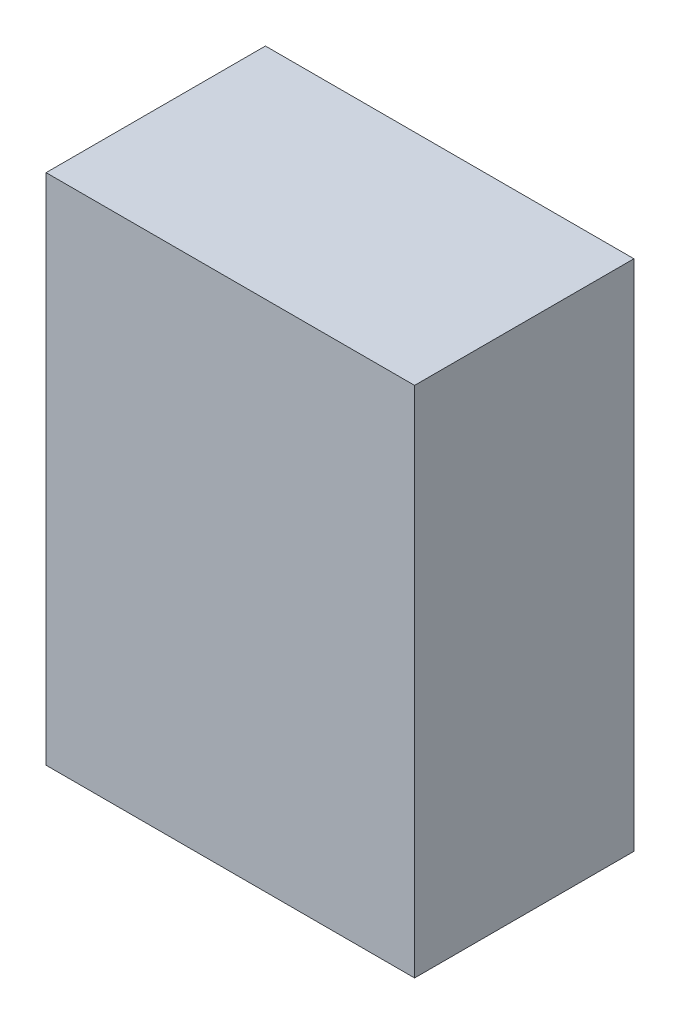
ISO-10303-21;
HEADER;
FILE_DESCRIPTION(('STEP AP214'),'2;1');
FILE_NAME('part.step','',(''),(''),'','','');
FILE_SCHEMA(('AUTOMOTIVE_DESIGN { 1 0 10303 214 1 1 1 1 }'));
ENDSEC;
DATA;
#1=APPLICATION_CONTEXT('core data for automotive mechanical design processes');
#2=APPLICATION_PROTOCOL_DEFINITION('international standard','automotive_design',2000,#1);
#3=PRODUCT_CONTEXT('',#1,'mechanical');
#4=PRODUCT('Part','Part','',(#3));
#5=PRODUCT_RELATED_PRODUCT_CATEGORY('part','',(#4));
#6=PRODUCT_DEFINITION_FORMATION('','',#4);
#7=PRODUCT_DEFINITION_CONTEXT('part definition',#1,'design');
#8=PRODUCT_DEFINITION('design','',#6,#7);
#9=PRODUCT_DEFINITION_SHAPE('','',#8);
#10=(LENGTH_UNIT() NAMED_UNIT(*) SI_UNIT(.MILLI.,.METRE.));
#11=(NAMED_UNIT(*) PLANE_ANGLE_UNIT() SI_UNIT($,.RADIAN.));
#12=(NAMED_UNIT(*) SI_UNIT($,.STERADIAN.) SOLID_ANGLE_UNIT());
#13=UNCERTAINTY_MEASURE_WITH_UNIT(LENGTH_MEASURE(1.E-05),#10,'distance_accuracy_value','');
#14=(GEOMETRIC_REPRESENTATION_CONTEXT(3) GLOBAL_UNCERTAINTY_ASSIGNED_CONTEXT((#13)) GLOBAL_UNIT_ASSIGNED_CONTEXT((#10,
#11,#12)) REPRESENTATION_CONTEXT('',''));
#15=CARTESIAN_POINT('',(0.,0.,0.));
#16=DIRECTION('',(0.,0.,1.));
#17=DIRECTION('',(1.,0.,0.));
#18=AXIS2_PLACEMENT_3D('',#15,#16,#17);
#19=CARTESIAN_POINT('',(-1.003,-1.397,0.));
#20=DIRECTION('',(0.,-1.,0.));
#21=DIRECTION('',(0.,0.,1.));
#22=AXIS2_PLACEMENT_3D('',#19,#20,#21);
#23=PLANE('',#22);
#24=DIRECTION('',(-1.,0.,0.));
#25=VECTOR('',#24,1.);
#26=CARTESIAN_POINT('',(1.003,-1.397,0.));
#27=LINE('',#26,#25);
#28=CARTESIAN_POINT('',(1.003,-1.397,0.));
#29=VERTEX_POINT('',#28);
#30=CARTESIAN_POINT('',(-1.003,-1.397,0.));
#31=VERTEX_POINT('',#30);
#32=EDGE_CURVE('E11',#29,#31,#27,.T.);
#33=ORIENTED_EDGE('',*,*,#32,.F.);
#34=DIRECTION('',(0.,0.,-1.));
#35=VECTOR('',#34,1.);
#36=CARTESIAN_POINT('',(1.003,-1.397,1.194));
#37=LINE('',#36,#35);
#38=CARTESIAN_POINT('',(1.003,-1.397,1.194));
#39=VERTEX_POINT('',#38);
#40=EDGE_CURVE('E24',#39,#29,#37,.T.);
#41=ORIENTED_EDGE('',*,*,#40,.F.);
#42=DIRECTION('',(1.,0.,0.));
#43=VECTOR('',#42,1.);
#44=CARTESIAN_POINT('',(-1.003,-1.397,1.194));
#45=LINE('',#44,#43);
#46=CARTESIAN_POINT('',(-1.003,-1.397,1.194));
#47=VERTEX_POINT('',#46);
#48=EDGE_CURVE('E88',#47,#39,#45,.T.);
#49=ORIENTED_EDGE('',*,*,#48,.F.);
#50=DIRECTION('',(0.,0.,1.));
#51=VECTOR('',#50,1.);
#52=CARTESIAN_POINT('',(-1.003,-1.397,0.));
#53=LINE('',#52,#51);
#54=EDGE_CURVE('E77',#31,#47,#53,.T.);
#55=ORIENTED_EDGE('',*,*,#54,.F.);
#56=EDGE_LOOP('',(#33,#41,#49,#55));
#57=FACE_BOUND('',#56,.T.);
#58=ADVANCED_FACE('F17',(#57),#23,.T.);
#59=CARTESIAN_POINT('',(1.003,-1.397,0.));
#60=DIRECTION('',(1.,0.,0.));
#61=DIRECTION('',(0.,0.,1.));
#62=AXIS2_PLACEMENT_3D('',#59,#60,#61);
#63=PLANE('',#62);
#64=DIRECTION('',(0.,-1.,0.));
#65=VECTOR('',#64,1.);
#66=CARTESIAN_POINT('',(1.003,1.397,0.));
#67=LINE('',#66,#65);
#68=CARTESIAN_POINT('',(1.003,1.397,0.));
#69=VERTEX_POINT('',#68);
#70=EDGE_CURVE('E85',#69,#29,#67,.T.);
#71=ORIENTED_EDGE('',*,*,#70,.F.);
#72=DIRECTION('',(0.,0.,-1.));
#73=VECTOR('',#72,1.);
#74=CARTESIAN_POINT('',(1.003,1.397,1.194));
#75=LINE('',#74,#73);
#76=CARTESIAN_POINT('',(1.003,1.397,1.194));
#77=VERTEX_POINT('',#76);
#78=EDGE_CURVE('E83',#77,#69,#75,.T.);
#79=ORIENTED_EDGE('',*,*,#78,.F.);
#80=DIRECTION('',(0.,1.,0.));
#81=VECTOR('',#80,1.);
#82=CARTESIAN_POINT('',(1.003,-1.397,1.194));
#83=LINE('',#82,#81);
#84=EDGE_CURVE('E72',#39,#77,#83,.T.);
#85=ORIENTED_EDGE('',*,*,#84,.F.);
#86=ORIENTED_EDGE('',*,*,#40,.T.);
#87=EDGE_LOOP('',(#71,#79,#85,#86));
#88=FACE_BOUND('',#87,.T.);
#89=ADVANCED_FACE('F90',(#88),#63,.T.);
#90=CARTESIAN_POINT('',(1.003,1.397,0.));
#91=DIRECTION('',(0.,1.,0.));
#92=DIRECTION('',(0.,0.,1.));
#93=AXIS2_PLACEMENT_3D('',#90,#91,#92);
#94=PLANE('',#93);
#95=DIRECTION('',(1.,0.,0.));
#96=VECTOR('',#95,1.);
#97=CARTESIAN_POINT('',(-1.003,1.397,0.));
#98=LINE('',#97,#96);
#99=CARTESIAN_POINT('',(-1.003,1.397,0.));
#100=VERTEX_POINT('',#99);
#101=EDGE_CURVE('E60',#100,#69,#98,.T.);
#102=ORIENTED_EDGE('',*,*,#101,.F.);
#103=DIRECTION('',(0.,0.,-1.));
#104=VECTOR('',#103,1.);
#105=CARTESIAN_POINT('',(-1.003,1.397,1.194));
#106=LINE('',#105,#104);
#107=CARTESIAN_POINT('',(-1.003,1.397,1.194));
#108=VERTEX_POINT('',#107);
#109=EDGE_CURVE('E54',#108,#100,#106,.T.);
#110=ORIENTED_EDGE('',*,*,#109,.F.);
#111=DIRECTION('',(-1.,0.,0.));
#112=VECTOR('',#111,1.);
#113=CARTESIAN_POINT('',(1.003,1.397,1.194));
#114=LINE('',#113,#112);
#115=EDGE_CURVE('E58',#77,#108,#114,.T.);
#116=ORIENTED_EDGE('',*,*,#115,.F.);
#117=ORIENTED_EDGE('',*,*,#78,.T.);
#118=EDGE_LOOP('',(#102,#110,#116,#117));
#119=FACE_BOUND('',#118,.T.);
#120=ADVANCED_FACE('F56',(#119),#94,.T.);
#121=CARTESIAN_POINT('',(-1.003,1.397,0.));
#122=DIRECTION('',(-1.,0.,0.));
#123=DIRECTION('',(0.,0.,1.));
#124=AXIS2_PLACEMENT_3D('',#121,#122,#123);
#125=PLANE('',#124);
#126=DIRECTION('',(0.,1.,0.));
#127=VECTOR('',#126,1.);
#128=CARTESIAN_POINT('',(-1.003,-1.397,0.));
#129=LINE('',#128,#127);
#130=EDGE_CURVE('E73',#31,#100,#129,.T.);
#131=ORIENTED_EDGE('',*,*,#130,.F.);
#132=ORIENTED_EDGE('',*,*,#54,.T.);
#133=DIRECTION('',(0.,-1.,0.));
#134=VECTOR('',#133,1.);
#135=CARTESIAN_POINT('',(-1.003,1.397,1.194));
#136=LINE('',#135,#134);
#137=EDGE_CURVE('E70',#108,#47,#136,.T.);
#138=ORIENTED_EDGE('',*,*,#137,.F.);
#139=ORIENTED_EDGE('',*,*,#109,.T.);
#140=EDGE_LOOP('',(#131,#132,#138,#139));
#141=FACE_BOUND('',#140,.T.);
#142=ADVANCED_FACE('F76',(#141),#125,.T.);
#143=CARTESIAN_POINT('',(-1.003,1.397,0.));
#144=DIRECTION('',(0.,0.,-1.));
#145=DIRECTION('',(0.,1.,0.));
#146=AXIS2_PLACEMENT_3D('',#143,#144,#145);
#147=PLANE('',#146);
#148=ORIENTED_EDGE('',*,*,#101,.T.);
#149=ORIENTED_EDGE('',*,*,#70,.T.);
#150=ORIENTED_EDGE('',*,*,#32,.T.);
#151=ORIENTED_EDGE('',*,*,#130,.T.);
#152=EDGE_LOOP('',(#148,#149,#150,#151));
#153=FACE_BOUND('',#152,.T.);
#154=ADVANCED_FACE('F91',(#153),#147,.T.);
#155=CARTESIAN_POINT('',(-1.003,-1.397,1.194));
#156=DIRECTION('',(0.,0.,1.));
#157=DIRECTION('',(0.,1.,0.));
#158=AXIS2_PLACEMENT_3D('',#155,#156,#157);
#159=PLANE('',#158);
#160=ORIENTED_EDGE('',*,*,#48,.T.);
#161=ORIENTED_EDGE('',*,*,#84,.T.);
#162=ORIENTED_EDGE('',*,*,#115,.T.);
#163=ORIENTED_EDGE('',*,*,#137,.T.);
#164=EDGE_LOOP('',(#160,#161,#162,#163));
#165=FACE_BOUND('',#164,.T.);
#166=ADVANCED_FACE('F69',(#165),#159,.T.);
#167=CLOSED_SHELL('',(#58,#89,#120,#142,#154,#166));
#168=MANIFOLD_SOLID_BREP('B1',#167);
#169=ADVANCED_BREP_SHAPE_REPRESENTATION('',(#18,#168),#14);
#170=SHAPE_DEFINITION_REPRESENTATION(#9,#169);
ENDSEC;
END-ISO-10303-21;
